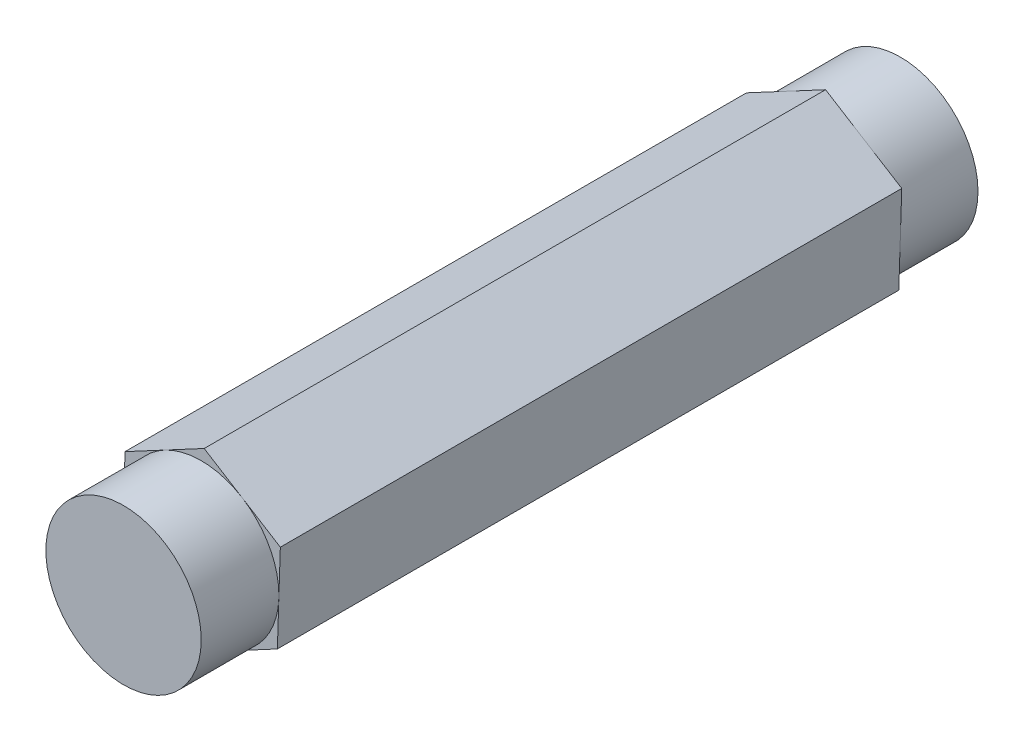
ISO-10303-21;
HEADER;
FILE_DESCRIPTION(('STEP AP214'),'2;1');
FILE_NAME('part.step','',(''),(''),'','','');
FILE_SCHEMA(('AUTOMOTIVE_DESIGN { 1 0 10303 214 1 1 1 1 }'));
ENDSEC;
DATA;
#1=APPLICATION_CONTEXT('core data for automotive mechanical design processes');
#2=APPLICATION_PROTOCOL_DEFINITION('international standard','automotive_design',2000,#1);
#3=PRODUCT_CONTEXT('',#1,'mechanical');
#4=PRODUCT('Part','Part','',(#3));
#5=PRODUCT_RELATED_PRODUCT_CATEGORY('part','',(#4));
#6=PRODUCT_DEFINITION_FORMATION('','',#4);
#7=PRODUCT_DEFINITION_CONTEXT('part definition',#1,'design');
#8=PRODUCT_DEFINITION('design','',#6,#7);
#9=PRODUCT_DEFINITION_SHAPE('','',#8);
#10=(LENGTH_UNIT() NAMED_UNIT(*) SI_UNIT(.MILLI.,.METRE.));
#11=(NAMED_UNIT(*) PLANE_ANGLE_UNIT() SI_UNIT($,.RADIAN.));
#12=(NAMED_UNIT(*) SI_UNIT($,.STERADIAN.) SOLID_ANGLE_UNIT());
#13=UNCERTAINTY_MEASURE_WITH_UNIT(LENGTH_MEASURE(1.E-05),#10,'distance_accuracy_value','');
#14=(GEOMETRIC_REPRESENTATION_CONTEXT(3) GLOBAL_UNCERTAINTY_ASSIGNED_CONTEXT((#13)) GLOBAL_UNIT_ASSIGNED_CONTEXT((#10,
#11,#12)) REPRESENTATION_CONTEXT('',''));
#15=CARTESIAN_POINT('',(0.,0.,0.));
#16=DIRECTION('',(0.,0.,1.));
#17=DIRECTION('',(1.,0.,0.));
#18=AXIS2_PLACEMENT_3D('',#15,#16,#17);
#19=CARTESIAN_POINT('',(0.,0.,2.));
#20=DIRECTION('',(0.,0.,1.));
#21=DIRECTION('',(1.,0.,0.));
#22=AXIS2_PLACEMENT_3D('',#19,#20,#21);
#23=PLANE('',#22);
#24=CARTESIAN_POINT('',(0.,0.,2.));
#25=DIRECTION('',(0.,0.,1.));
#26=DIRECTION('',(1.,0.,0.));
#27=AXIS2_PLACEMENT_3D('',#24,#25,#26);
#28=CIRCLE('',#27,0.250000000000004);
#29=CARTESIAN_POINT('',(0.13207520611128,0.2122643161972,2.));
#30=VERTEX_POINT('',#29);
#31=CARTESIAN_POINT('',(-0.117788687088068,0.220512641801033,2.));
#32=VERTEX_POINT('',#31);
#33=EDGE_CURVE('E217',#30,#32,#28,.T.);
#34=ORIENTED_EDGE('',*,*,#33,.F.);
#35=DIRECTION('',(-0.849057264788787,0.528300824445111,0.));
#36=VECTOR('',#35,1.);
#37=CARTESIAN_POINT('',(0.254626066207086,0.136010660395577,2.));
#38=LINE('',#37,#36);
#39=CARTESIAN_POINT('',(0.00952434601547537,0.288517971998823,2.));
#40=VERTEX_POINT('',#39);
#41=EDGE_CURVE('E265',#30,#40,#38,.T.);
#42=ORIENTED_EDGE('',*,*,#41,.T.);
#43=DIRECTION('',(-0.882050567204122,-0.471154748352266,0.));
#44=VECTOR('',#43,1.);
#45=CARTESIAN_POINT('',(0.00952434601547537,0.288517971998823,2.));
#46=LINE('',#45,#44);
#47=EDGE_CURVE('E282',#40,#32,#46,.T.);
#48=ORIENTED_EDGE('',*,*,#47,.T.);
#49=EDGE_LOOP('',(#34,#42,#48));
#50=FACE_BOUND('',#49,.T.);
#51=ADVANCED_FACE('F41',(#50),#23,.T.);
#52=CARTESIAN_POINT('',(-0.249863893199345,0.00824832560383198,2.));
#53=VERTEX_POINT('',#52);
#54=EDGE_CURVE('E301',#32,#53,#28,.T.);
#55=ORIENTED_EDGE('',*,*,#54,.F.);
#56=CARTESIAN_POINT('',(-0.245101720191609,0.152507311603245,2.));
#57=VERTEX_POINT('',#56);
#58=EDGE_CURVE('E175',#32,#57,#46,.T.);
#59=ORIENTED_EDGE('',*,*,#58,.T.);
#60=DIRECTION('',(-0.0329933024153278,-0.999455572797376,0.));
#61=VECTOR('',#60,1.);
#62=CARTESIAN_POINT('',(-0.245101720191609,0.152507311603245,2.));
#63=LINE('',#62,#61);
#64=EDGE_CURVE('E204',#57,#53,#63,.T.);
#65=ORIENTED_EDGE('',*,*,#64,.T.);
#66=EDGE_LOOP('',(#55,#59,#65));
#67=FACE_BOUND('',#66,.T.);
#68=ADVANCED_FACE('F310',(#67),#23,.T.);
#69=CARTESIAN_POINT('',(-0.132075206111278,-0.212264316197197,2.));
#70=VERTEX_POINT('',#69);
#71=EDGE_CURVE('E277',#53,#70,#28,.T.);
#72=ORIENTED_EDGE('',*,*,#71,.F.);
#73=CARTESIAN_POINT('',(-0.254626066207081,-0.136010660395575,2.));
#74=VERTEX_POINT('',#73);
#75=EDGE_CURVE('E285',#53,#74,#63,.T.);
#76=ORIENTED_EDGE('',*,*,#75,.T.);
#77=DIRECTION('',(0.849057264788787,-0.52830082444511,0.));
#78=VECTOR('',#77,1.);
#79=CARTESIAN_POINT('',(-0.254626066207081,-0.136010660395575,2.));
#80=LINE('',#79,#78);
#81=EDGE_CURVE('E289',#74,#70,#80,.T.);
#82=ORIENTED_EDGE('',*,*,#81,.T.);
#83=EDGE_LOOP('',(#72,#76,#82));
#84=FACE_BOUND('',#83,.T.);
#85=ADVANCED_FACE('F305',(#84),#23,.T.);
#86=CARTESIAN_POINT('',(0.117788687088063,-0.220512641801035,2.));
#87=VERTEX_POINT('',#86);
#88=EDGE_CURVE('E272',#70,#87,#28,.T.);
#89=ORIENTED_EDGE('',*,*,#88,.F.);
#90=CARTESIAN_POINT('',(-0.00952434601547407,-0.288517971998818,2.));
#91=VERTEX_POINT('',#90);
#92=EDGE_CURVE('E288',#70,#91,#80,.T.);
#93=ORIENTED_EDGE('',*,*,#92,.T.);
#94=DIRECTION('',(0.882050567204131,0.471154748352249,0.));
#95=VECTOR('',#94,1.);
#96=CARTESIAN_POINT('',(-0.00952434601547407,-0.288517971998818,2.));
#97=LINE('',#96,#95);
#98=EDGE_CURVE('E260',#91,#87,#97,.T.);
#99=ORIENTED_EDGE('',*,*,#98,.T.);
#100=EDGE_LOOP('',(#89,#93,#99));
#101=FACE_BOUND('',#100,.T.);
#102=ADVANCED_FACE('F316',(#101),#23,.T.);
#103=CARTESIAN_POINT('',(0.249863893199349,-0.00824832560383393,2.));
#104=VERTEX_POINT('',#103);
#105=EDGE_CURVE('E66',#87,#104,#28,.T.);
#106=ORIENTED_EDGE('',*,*,#105,.F.);
#107=CARTESIAN_POINT('',(0.245101720191611,-0.152507311603247,2.));
#108=VERTEX_POINT('',#107);
#109=EDGE_CURVE('E263',#87,#108,#97,.T.);
#110=ORIENTED_EDGE('',*,*,#109,.T.);
#111=DIRECTION('',(0.0329933024153351,0.999455572797376,0.));
#112=VECTOR('',#111,1.);
#113=CARTESIAN_POINT('',(0.245101720191611,-0.152507311603247,2.));
#114=LINE('',#113,#112);
#115=EDGE_CURVE('E258',#108,#104,#114,.T.);
#116=ORIENTED_EDGE('',*,*,#115,.T.);
#117=EDGE_LOOP('',(#106,#110,#116));
#118=FACE_BOUND('',#117,.T.);
#119=ADVANCED_FACE('F262',(#118),#23,.T.);
#120=CARTESIAN_POINT('',(0.,0.,0.));
#121=DIRECTION('',(0.,0.,1.));
#122=DIRECTION('',(1.,0.,0.));
#123=AXIS2_PLACEMENT_3D('',#120,#121,#122);
#124=PLANE('',#123);
#125=DIRECTION('',(-0.849057264788787,0.528300824445111,0.));
#126=VECTOR('',#125,1.);
#127=CARTESIAN_POINT('',(0.254626066207086,0.136010660395577,0.));
#128=LINE('',#127,#126);
#129=CARTESIAN_POINT('',(0.13207520611128,0.2122643161972,0.));
#130=VERTEX_POINT('',#129);
#131=CARTESIAN_POINT('',(0.00952434601547537,0.288517971998823,0.));
#132=VERTEX_POINT('',#131);
#133=EDGE_CURVE('E168',#130,#132,#128,.T.);
#134=ORIENTED_EDGE('',*,*,#133,.F.);
#135=CARTESIAN_POINT('',(0.,0.,0.));
#136=DIRECTION('',(0.,0.,1.));
#137=DIRECTION('',(1.,0.,0.));
#138=AXIS2_PLACEMENT_3D('',#135,#136,#137);
#139=CIRCLE('',#138,0.250000000000004);
#140=CARTESIAN_POINT('',(-0.117788687088068,0.220512641801033,0.));
#141=VERTEX_POINT('',#140);
#142=EDGE_CURVE('E12',#130,#141,#139,.T.);
#143=ORIENTED_EDGE('',*,*,#142,.T.);
#144=DIRECTION('',(-0.882050567204122,-0.471154748352266,0.));
#145=VECTOR('',#144,1.);
#146=CARTESIAN_POINT('',(0.00952434601547537,0.288517971998823,0.));
#147=LINE('',#146,#145);
#148=EDGE_CURVE('E213',#132,#141,#147,.T.);
#149=ORIENTED_EDGE('',*,*,#148,.F.);
#150=EDGE_LOOP('',(#134,#143,#149));
#151=FACE_BOUND('',#150,.T.);
#152=ADVANCED_FACE('F251',(#151),#124,.F.);
#153=CARTESIAN_POINT('',(-0.245101720191609,0.152507311603245,0.));
#154=VERTEX_POINT('',#153);
#155=EDGE_CURVE('E211',#141,#154,#147,.T.);
#156=ORIENTED_EDGE('',*,*,#155,.F.);
#157=CARTESIAN_POINT('',(-0.249863893199345,0.00824832560383198,0.));
#158=VERTEX_POINT('',#157);
#159=EDGE_CURVE('E51',#141,#158,#139,.T.);
#160=ORIENTED_EDGE('',*,*,#159,.T.);
#161=DIRECTION('',(-0.0329933024153278,-0.999455572797376,0.));
#162=VECTOR('',#161,1.);
#163=CARTESIAN_POINT('',(-0.245101720191609,0.152507311603245,0.));
#164=LINE('',#163,#162);
#165=EDGE_CURVE('E201',#154,#158,#164,.T.);
#166=ORIENTED_EDGE('',*,*,#165,.F.);
#167=EDGE_LOOP('',(#156,#160,#166));
#168=FACE_BOUND('',#167,.T.);
#169=ADVANCED_FACE('F219',(#168),#124,.F.);
#170=CARTESIAN_POINT('',(-0.254626066207081,-0.136010660395575,0.));
#171=VERTEX_POINT('',#170);
#172=EDGE_CURVE('E223',#158,#171,#164,.T.);
#173=ORIENTED_EDGE('',*,*,#172,.F.);
#174=CARTESIAN_POINT('',(-0.132075206111278,-0.212264316197197,0.));
#175=VERTEX_POINT('',#174);
#176=EDGE_CURVE('E245',#158,#175,#139,.T.);
#177=ORIENTED_EDGE('',*,*,#176,.T.);
#178=DIRECTION('',(0.849057264788787,-0.52830082444511,0.));
#179=VECTOR('',#178,1.);
#180=CARTESIAN_POINT('',(-0.254626066207081,-0.136010660395575,0.));
#181=LINE('',#180,#179);
#182=EDGE_CURVE('E227',#171,#175,#181,.T.);
#183=ORIENTED_EDGE('',*,*,#182,.F.);
#184=EDGE_LOOP('',(#173,#177,#183));
#185=FACE_BOUND('',#184,.T.);
#186=ADVANCED_FACE('F249',(#185),#124,.F.);
#187=CARTESIAN_POINT('',(-0.00952434601547407,-0.288517971998818,0.));
#188=VERTEX_POINT('',#187);
#189=EDGE_CURVE('E222',#175,#188,#181,.T.);
#190=ORIENTED_EDGE('',*,*,#189,.F.);
#191=CARTESIAN_POINT('',(0.117788687088063,-0.220512641801035,0.));
#192=VERTEX_POINT('',#191);
#193=EDGE_CURVE('E151',#175,#192,#139,.T.);
#194=ORIENTED_EDGE('',*,*,#193,.T.);
#195=DIRECTION('',(0.882050567204131,0.471154748352249,0.));
#196=VECTOR('',#195,1.);
#197=CARTESIAN_POINT('',(-0.00952434601547407,-0.288517971998818,0.));
#198=LINE('',#197,#196);
#199=EDGE_CURVE('E160',#188,#192,#198,.T.);
#200=ORIENTED_EDGE('',*,*,#199,.F.);
#201=EDGE_LOOP('',(#190,#194,#200));
#202=FACE_BOUND('',#201,.T.);
#203=ADVANCED_FACE('F242',(#202),#124,.F.);
#204=CARTESIAN_POINT('',(0.245101720191611,-0.152507311603247,0.));
#205=VERTEX_POINT('',#204);
#206=EDGE_CURVE('E148',#192,#205,#198,.T.);
#207=ORIENTED_EDGE('',*,*,#206,.F.);
#208=CARTESIAN_POINT('',(0.249863893199349,-0.00824832560383393,0.));
#209=VERTEX_POINT('',#208);
#210=EDGE_CURVE('E134',#192,#209,#139,.T.);
#211=ORIENTED_EDGE('',*,*,#210,.T.);
#212=DIRECTION('',(0.0329933024153351,0.999455572797376,0.));
#213=VECTOR('',#212,1.);
#214=CARTESIAN_POINT('',(0.245101720191611,-0.152507311603247,0.));
#215=LINE('',#214,#213);
#216=EDGE_CURVE('E147',#205,#209,#215,.T.);
#217=ORIENTED_EDGE('',*,*,#216,.F.);
#218=EDGE_LOOP('',(#207,#211,#217));
#219=FACE_BOUND('',#218,.T.);
#220=ADVANCED_FACE('F145',(#219),#124,.F.);
#221=CARTESIAN_POINT('',(0.00952434601547537,0.288517971998823,2.));
#222=DIRECTION('',(0.471154748352266,-0.882050567204122,0.));
#223=DIRECTION('',(0.882050567204122,0.471154748352266,0.));
#224=AXIS2_PLACEMENT_3D('',#221,#222,#223);
#225=PLANE('',#224);
#226=ORIENTED_EDGE('',*,*,#148,.T.);
#227=ORIENTED_EDGE('',*,*,#155,.T.);
#228=DIRECTION('',(0.,0.,-1.));
#229=VECTOR('',#228,1.);
#230=CARTESIAN_POINT('',(-0.245101720191609,0.152507311603245,2.));
#231=LINE('',#230,#229);
#232=EDGE_CURVE('E141',#57,#154,#231,.T.);
#233=ORIENTED_EDGE('',*,*,#232,.F.);
#234=ORIENTED_EDGE('',*,*,#58,.F.);
#235=ORIENTED_EDGE('',*,*,#47,.F.);
#236=DIRECTION('',(0.,0.,-1.));
#237=VECTOR('',#236,1.);
#238=CARTESIAN_POINT('',(0.00952434601547537,0.288517971998823,2.));
#239=LINE('',#238,#237);
#240=EDGE_CURVE('E176',#40,#132,#239,.T.);
#241=ORIENTED_EDGE('',*,*,#240,.T.);
#242=EDGE_LOOP('',(#226,#227,#233,#234,#235,#241));
#243=FACE_BOUND('',#242,.T.);
#244=ADVANCED_FACE('F43',(#243),#225,.F.);
#245=CARTESIAN_POINT('',(-0.245101720191609,0.152507311603245,2.));
#246=DIRECTION('',(0.999455572797376,-0.0329933024153278,0.));
#247=DIRECTION('',(0.0329933024153278,0.999455572797376,0.));
#248=AXIS2_PLACEMENT_3D('',#245,#246,#247);
#249=PLANE('',#248);
#250=ORIENTED_EDGE('',*,*,#165,.T.);
#251=ORIENTED_EDGE('',*,*,#172,.T.);
#252=DIRECTION('',(0.,0.,-1.));
#253=VECTOR('',#252,1.);
#254=CARTESIAN_POINT('',(-0.254626066207081,-0.136010660395575,2.));
#255=LINE('',#254,#253);
#256=EDGE_CURVE('E190',#74,#171,#255,.T.);
#257=ORIENTED_EDGE('',*,*,#256,.F.);
#258=ORIENTED_EDGE('',*,*,#75,.F.);
#259=ORIENTED_EDGE('',*,*,#64,.F.);
#260=ORIENTED_EDGE('',*,*,#232,.T.);
#261=EDGE_LOOP('',(#250,#251,#257,#258,#259,#260));
#262=FACE_BOUND('',#261,.T.);
#263=ADVANCED_FACE('F199',(#262),#249,.F.);
#264=CARTESIAN_POINT('',(-0.254626066207081,-0.136010660395575,2.));
#265=DIRECTION('',(0.528300824445111,0.849057264788787,0.));
#266=DIRECTION('',(-0.849057264788787,0.528300824445111,0.));
#267=AXIS2_PLACEMENT_3D('',#264,#265,#266);
#268=PLANE('',#267);
#269=ORIENTED_EDGE('',*,*,#182,.T.);
#270=ORIENTED_EDGE('',*,*,#189,.T.);
#271=DIRECTION('',(0.,0.,-1.));
#272=VECTOR('',#271,1.);
#273=CARTESIAN_POINT('',(-0.00952434601547407,-0.288517971998818,2.));
#274=LINE('',#273,#272);
#275=EDGE_CURVE('E186',#91,#188,#274,.T.);
#276=ORIENTED_EDGE('',*,*,#275,.F.);
#277=ORIENTED_EDGE('',*,*,#92,.F.);
#278=ORIENTED_EDGE('',*,*,#81,.F.);
#279=ORIENTED_EDGE('',*,*,#256,.T.);
#280=EDGE_LOOP('',(#269,#270,#276,#277,#278,#279));
#281=FACE_BOUND('',#280,.T.);
#282=ADVANCED_FACE('F317',(#281),#268,.F.);
#283=CARTESIAN_POINT('',(-0.00952434601547407,-0.288517971998818,2.));
#284=DIRECTION('',(-0.471154748352249,0.882050567204131,0.));
#285=DIRECTION('',(-0.882050567204131,-0.471154748352249,0.));
#286=AXIS2_PLACEMENT_3D('',#283,#284,#285);
#287=PLANE('',#286);
#288=ORIENTED_EDGE('',*,*,#199,.T.);
#289=ORIENTED_EDGE('',*,*,#206,.T.);
#290=DIRECTION('',(0.,0.,-1.));
#291=VECTOR('',#290,1.);
#292=CARTESIAN_POINT('',(0.245101720191611,-0.152507311603247,2.));
#293=LINE('',#292,#291);
#294=EDGE_CURVE('E166',#108,#205,#293,.T.);
#295=ORIENTED_EDGE('',*,*,#294,.F.);
#296=ORIENTED_EDGE('',*,*,#109,.F.);
#297=ORIENTED_EDGE('',*,*,#98,.F.);
#298=ORIENTED_EDGE('',*,*,#275,.T.);
#299=EDGE_LOOP('',(#288,#289,#295,#296,#297,#298));
#300=FACE_BOUND('',#299,.T.);
#301=ADVANCED_FACE('F237',(#300),#287,.F.);
#302=CARTESIAN_POINT('',(0.245101720191611,-0.152507311603247,2.));
#303=DIRECTION('',(-0.999455572797376,0.0329933024153351,0.));
#304=DIRECTION('',(-0.0329933024153351,-0.999455572797376,0.));
#305=AXIS2_PLACEMENT_3D('',#302,#303,#304);
#306=PLANE('',#305);
#307=ORIENTED_EDGE('',*,*,#216,.T.);
#308=CARTESIAN_POINT('',(0.254626066207086,0.136010660395577,0.));
#309=VERTEX_POINT('',#308);
#310=EDGE_CURVE('E152',#209,#309,#215,.T.);
#311=ORIENTED_EDGE('',*,*,#310,.T.);
#312=DIRECTION('',(0.,0.,-1.));
#313=VECTOR('',#312,1.);
#314=CARTESIAN_POINT('',(0.254626066207086,0.136010660395577,2.));
#315=LINE('',#314,#313);
#316=CARTESIAN_POINT('',(0.254626066207086,0.136010660395577,2.));
#317=VERTEX_POINT('',#316);
#318=EDGE_CURVE('E180',#317,#309,#315,.T.);
#319=ORIENTED_EDGE('',*,*,#318,.F.);
#320=EDGE_CURVE('E257',#104,#317,#114,.T.);
#321=ORIENTED_EDGE('',*,*,#320,.F.);
#322=ORIENTED_EDGE('',*,*,#115,.F.);
#323=ORIENTED_EDGE('',*,*,#294,.T.);
#324=EDGE_LOOP('',(#307,#311,#319,#321,#322,#323));
#325=FACE_BOUND('',#324,.T.);
#326=ADVANCED_FACE('F163',(#325),#306,.F.);
#327=CARTESIAN_POINT('',(0.254626066207086,0.136010660395577,2.));
#328=DIRECTION('',(-0.528300824445111,-0.849057264788787,0.));
#329=DIRECTION('',(0.849057264788787,-0.528300824445111,0.));
#330=AXIS2_PLACEMENT_3D('',#327,#328,#329);
#331=PLANE('',#330);
#332=EDGE_CURVE('E155',#309,#130,#128,.T.);
#333=ORIENTED_EDGE('',*,*,#332,.T.);
#334=ORIENTED_EDGE('',*,*,#133,.T.);
#335=ORIENTED_EDGE('',*,*,#240,.F.);
#336=ORIENTED_EDGE('',*,*,#41,.F.);
#337=EDGE_CURVE('E181',#317,#30,#38,.T.);
#338=ORIENTED_EDGE('',*,*,#337,.F.);
#339=ORIENTED_EDGE('',*,*,#318,.T.);
#340=EDGE_LOOP('',(#333,#334,#335,#336,#338,#339));
#341=FACE_BOUND('',#340,.T.);
#342=ADVANCED_FACE('F254',(#341),#331,.F.);
#343=EDGE_CURVE('E58',#104,#30,#28,.T.);
#344=ORIENTED_EDGE('',*,*,#343,.F.);
#345=ORIENTED_EDGE('',*,*,#320,.T.);
#346=ORIENTED_EDGE('',*,*,#337,.T.);
#347=EDGE_LOOP('',(#344,#345,#346));
#348=FACE_BOUND('',#347,.T.);
#349=ADVANCED_FACE('F327',(#348),#23,.T.);
#350=ORIENTED_EDGE('',*,*,#310,.F.);
#351=EDGE_CURVE('E45',#209,#130,#139,.T.);
#352=ORIENTED_EDGE('',*,*,#351,.T.);
#353=ORIENTED_EDGE('',*,*,#332,.F.);
#354=EDGE_LOOP('',(#350,#352,#353));
#355=FACE_BOUND('',#354,.T.);
#356=ADVANCED_FACE('F153',(#355),#124,.F.);
#357=CARTESIAN_POINT('',(0.,0.,-0.25));
#358=DIRECTION('',(0.,0.,1.));
#359=DIRECTION('',(1.,0.,0.));
#360=AXIS2_PLACEMENT_3D('',#357,#358,#359);
#361=PLANE('',#360);
#362=CARTESIAN_POINT('',(0.,0.,-0.25));
#363=DIRECTION('',(0.,0.,1.));
#364=DIRECTION('',(1.,0.,0.));
#365=AXIS2_PLACEMENT_3D('',#362,#363,#364);
#366=CIRCLE('',#365,0.250000000000004);
#367=CARTESIAN_POINT('',(0.250000000000004,0.,-0.25));
#368=VERTEX_POINT('',#367);
#369=EDGE_CURVE('E278',#368,#368,#366,.F.);
#370=ORIENTED_EDGE('',*,*,#369,.T.);
#371=EDGE_LOOP('',(#370));
#372=FACE_BOUND('',#371,.T.);
#373=ADVANCED_FACE('F338',(#372),#361,.F.);
#374=CARTESIAN_POINT('',(0.,0.,-1.20710678118656));
#375=DIRECTION('',(0.,0.,1.));
#376=DIRECTION('',(1.,0.,0.));
#377=AXIS2_PLACEMENT_3D('',#374,#375,#376);
#378=CYLINDRICAL_SURFACE('',#377,0.250000000000004);
#379=ORIENTED_EDGE('',*,*,#369,.F.);
#380=EDGE_LOOP('',(#379));
#381=FACE_BOUND('',#380,.T.);
#382=ORIENTED_EDGE('',*,*,#142,.F.);
#383=ORIENTED_EDGE('',*,*,#351,.F.);
#384=ORIENTED_EDGE('',*,*,#210,.F.);
#385=ORIENTED_EDGE('',*,*,#193,.F.);
#386=ORIENTED_EDGE('',*,*,#176,.F.);
#387=ORIENTED_EDGE('',*,*,#159,.F.);
#388=EDGE_LOOP('',(#382,#383,#384,#385,#386,#387));
#389=FACE_BOUND('',#388,.T.);
#390=ADVANCED_FACE('F133',(#381,#389),#378,.T.);
#391=ORIENTED_EDGE('',*,*,#343,.T.);
#392=ORIENTED_EDGE('',*,*,#33,.T.);
#393=ORIENTED_EDGE('',*,*,#54,.T.);
#394=ORIENTED_EDGE('',*,*,#71,.T.);
#395=ORIENTED_EDGE('',*,*,#88,.T.);
#396=ORIENTED_EDGE('',*,*,#105,.T.);
#397=EDGE_LOOP('',(#391,#392,#393,#394,#395,#396));
#398=FACE_BOUND('',#397,.T.);
#399=CARTESIAN_POINT('',(0.,0.,2.25));
#400=DIRECTION('',(0.,0.,1.));
#401=DIRECTION('',(1.,0.,0.));
#402=AXIS2_PLACEMENT_3D('',#399,#400,#401);
#403=CIRCLE('',#402,0.250000000000004);
#404=CARTESIAN_POINT('',(0.250000000000004,0.,2.25));
#405=VERTEX_POINT('',#404);
#406=EDGE_CURVE('E489',#405,#405,#403,.T.);
#407=ORIENTED_EDGE('',*,*,#406,.F.);
#408=EDGE_LOOP('',(#407));
#409=FACE_BOUND('',#408,.T.);
#410=ADVANCED_FACE('F268',(#398,#409),#378,.T.);
#411=CARTESIAN_POINT('',(0.,0.,2.25));
#412=DIRECTION('',(0.,0.,1.));
#413=DIRECTION('',(1.,0.,0.));
#414=AXIS2_PLACEMENT_3D('',#411,#412,#413);
#415=PLANE('',#414);
#416=ORIENTED_EDGE('',*,*,#406,.T.);
#417=EDGE_LOOP('',(#416));
#418=FACE_BOUND('',#417,.T.);
#419=ADVANCED_FACE('F384',(#418),#415,.T.);
#420=CLOSED_SHELL('',(#51,#68,#85,#102,#119,#152,#169,#186,#203,#220,#244,#263,#282,#301,#326,
#342,#349,#356,#373,#390,#410,#419));
#421=MANIFOLD_SOLID_BREP('B2',#420);
#422=ADVANCED_BREP_SHAPE_REPRESENTATION('',(#18,#421),#14);
#423=SHAPE_DEFINITION_REPRESENTATION(#9,#422);
ENDSEC;
END-ISO-10303-21;
